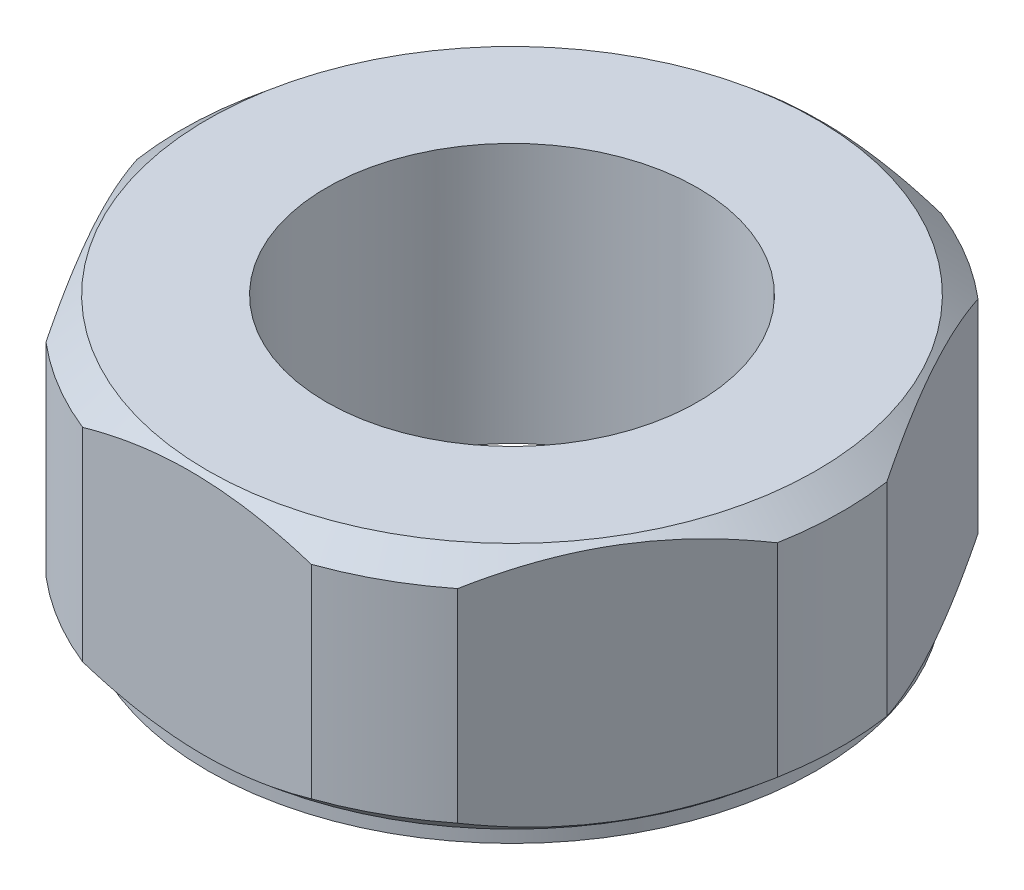
ISO-10303-21;
HEADER;
FILE_DESCRIPTION(('STEP AP214'),'2;1');
FILE_NAME('part.step','',(''),(''),'','','');
FILE_SCHEMA(('AUTOMOTIVE_DESIGN { 1 0 10303 214 1 1 1 1 }'));
ENDSEC;
DATA;
#1=APPLICATION_CONTEXT('core data for automotive mechanical design processes');
#2=APPLICATION_PROTOCOL_DEFINITION('international standard','automotive_design',2000,#1);
#3=PRODUCT_CONTEXT('',#1,'mechanical');
#4=PRODUCT('Part','Part','',(#3));
#5=PRODUCT_RELATED_PRODUCT_CATEGORY('part','',(#4));
#6=PRODUCT_DEFINITION_FORMATION('','',#4);
#7=PRODUCT_DEFINITION_CONTEXT('part definition',#1,'design');
#8=PRODUCT_DEFINITION('design','',#6,#7);
#9=PRODUCT_DEFINITION_SHAPE('','',#8);
#10=(LENGTH_UNIT() NAMED_UNIT(*) SI_UNIT(.MILLI.,.METRE.));
#11=(NAMED_UNIT(*) PLANE_ANGLE_UNIT() SI_UNIT($,.RADIAN.));
#12=(NAMED_UNIT(*) SI_UNIT($,.STERADIAN.) SOLID_ANGLE_UNIT());
#13=UNCERTAINTY_MEASURE_WITH_UNIT(LENGTH_MEASURE(1.E-05),#10,'distance_accuracy_value','');
#14=(GEOMETRIC_REPRESENTATION_CONTEXT(3) GLOBAL_UNCERTAINTY_ASSIGNED_CONTEXT((#13)) GLOBAL_UNIT_ASSIGNED_CONTEXT((#10,
#11,#12)) REPRESENTATION_CONTEXT('',''));
#15=CARTESIAN_POINT('',(0.,0.,0.));
#16=DIRECTION('',(0.,0.,1.));
#17=DIRECTION('',(1.,0.,0.));
#18=AXIS2_PLACEMENT_3D('',#15,#16,#17);
#19=CARTESIAN_POINT('',(0.,2.,0.));
#20=DIRECTION('',(0.,1.,0.));
#21=DIRECTION('',(0.,0.,1.));
#22=AXIS2_PLACEMENT_3D('',#19,#20,#21);
#23=PLANE('',#22);
#24=CARTESIAN_POINT('',(0.,2.,0.));
#25=DIRECTION('',(0.,1.,0.));
#26=DIRECTION('',(0.,0.,1.));
#27=AXIS2_PLACEMENT_3D('',#24,#25,#26);
#28=CIRCLE('',#27,1.5);
#29=CARTESIAN_POINT('',(0.,2.,1.5));
#30=VERTEX_POINT('',#29);
#31=EDGE_CURVE('E153',#30,#30,#28,.T.);
#32=ORIENTED_EDGE('',*,*,#31,.F.);
#33=EDGE_LOOP('',(#32));
#34=FACE_BOUND('',#33,.T.);
#35=CARTESIAN_POINT('',(0.,2.,0.));
#36=DIRECTION('',(0.,1.,0.));
#37=DIRECTION('',(0.,0.,1.));
#38=AXIS2_PLACEMENT_3D('',#35,#36,#37);
#39=CIRCLE('',#38,2.45945895598492);
#40=CARTESIAN_POINT('',(0.,2.,2.45945895598492));
#41=VERTEX_POINT('',#40);
#42=EDGE_CURVE('E139',#41,#41,#39,.F.);
#43=ORIENTED_EDGE('',*,*,#42,.F.);
#44=EDGE_LOOP('',(#43));
#45=FACE_BOUND('',#44,.T.);
#46=ADVANCED_FACE('F39',(#34,#45),#23,.T.);
#47=CARTESIAN_POINT('',(0.,2.2,0.));
#48=DIRECTION('',(0.,-1.,0.));
#49=DIRECTION('',(0.,0.,-1.));
#50=AXIS2_PLACEMENT_3D('',#47,#48,#49);
#51=CYLINDRICAL_SURFACE('',#50,1.5);
#52=ORIENTED_EDGE('',*,*,#31,.T.);
#53=EDGE_LOOP('',(#52));
#54=FACE_BOUND('',#53,.T.);
#55=CARTESIAN_POINT('',(0.,-0.1,0.));
#56=DIRECTION('',(0.,-1.,0.));
#57=DIRECTION('',(0.,0.,-1.));
#58=AXIS2_PLACEMENT_3D('',#55,#56,#57);
#59=CIRCLE('',#58,1.5);
#60=CARTESIAN_POINT('',(0.,-0.1,-1.5));
#61=VERTEX_POINT('',#60);
#62=EDGE_CURVE('E322',#61,#61,#59,.T.);
#63=ORIENTED_EDGE('',*,*,#62,.T.);
#64=EDGE_LOOP('',(#63));
#65=FACE_BOUND('',#64,.T.);
#66=ADVANCED_FACE('F211',(#54,#65),#51,.F.);
#67=CARTESIAN_POINT('',(0.,0.,0.));
#68=DIRECTION('',(0.,-1.,0.));
#69=DIRECTION('',(0.,0.,-1.));
#70=AXIS2_PLACEMENT_3D('',#67,#68,#69);
#71=CYLINDRICAL_SURFACE('',#70,2.67135379326874);
#72=CARTESIAN_POINT('',(0.,0.179295631547854,0.));
#73=DIRECTION('',(0.,-1.,0.));
#74=DIRECTION('',(0.,0.,-1.));
#75=AXIS2_PLACEMENT_3D('',#72,#73,#74);
#76=CIRCLE('',#75,2.67135379326874);
#77=CARTESIAN_POINT('',(-1.65580771527057,0.179295631547854,-2.09629003214292));
#78=VERTEX_POINT('',#77);
#79=CARTESIAN_POINT('',(-0.894830518071027,0.179295631547854,-2.51702392375203));
#80=VERTEX_POINT('',#79);
#81=EDGE_CURVE('E135',#78,#80,#76,.T.);
#82=ORIENTED_EDGE('',*,*,#81,.F.);
#83=DIRECTION('',(0.,-1.,0.));
#84=VECTOR('',#83,1.);
#85=CARTESIAN_POINT('',(-1.65580771527057,0.,-2.09629003214292));
#86=LINE('',#85,#84);
#87=CARTESIAN_POINT('',(-1.65580771527057,1.82070436845215,-2.09629003214292));
#88=VERTEX_POINT('',#87);
#89=EDGE_CURVE('E156',#88,#78,#86,.T.);
#90=ORIENTED_EDGE('',*,*,#89,.F.);
#91=CARTESIAN_POINT('',(0.,1.82070436845215,0.));
#92=DIRECTION('',(0.,-1.,0.));
#93=DIRECTION('',(0.,0.,-1.));
#94=AXIS2_PLACEMENT_3D('',#91,#92,#93);
#95=CIRCLE('',#94,2.67135379326874);
#96=CARTESIAN_POINT('',(-0.894830518071028,1.82070436845215,-2.51702392375203));
#97=VERTEX_POINT('',#96);
#98=EDGE_CURVE('E61',#88,#97,#95,.T.);
#99=ORIENTED_EDGE('',*,*,#98,.T.);
#100=DIRECTION('',(0.,-1.,0.));
#101=VECTOR('',#100,1.);
#102=CARTESIAN_POINT('',(-0.894830518071027,0.,-2.51702392375203));
#103=LINE('',#102,#101);
#104=EDGE_CURVE('E150',#80,#97,#103,.F.);
#105=ORIENTED_EDGE('',*,*,#104,.F.);
#106=EDGE_LOOP('',(#82,#90,#99,#105));
#107=FACE_BOUND('',#106,.T.);
#108=ADVANCED_FACE('F209',(#107),#71,.T.);
#109=CARTESIAN_POINT('',(0.987536563900582,1.82070436845215,-2.48211656127804));
#110=VERTEX_POINT('',#109);
#111=CARTESIAN_POINT('',(1.73239140086693,1.82070436845215,-2.03345792260711));
#112=VERTEX_POINT('',#111);
#113=EDGE_CURVE('E55',#110,#112,#95,.T.);
#114=ORIENTED_EDGE('',*,*,#113,.T.);
#115=DIRECTION('',(0.,-1.,0.));
#116=VECTOR('',#115,1.);
#117=CARTESIAN_POINT('',(1.73239140086693,0.,-2.03345792260711));
#118=LINE('',#117,#116);
#119=CARTESIAN_POINT('',(1.73239140086693,0.179295631547854,-2.03345792260711));
#120=VERTEX_POINT('',#119);
#121=EDGE_CURVE('E11',#120,#112,#118,.F.);
#122=ORIENTED_EDGE('',*,*,#121,.F.);
#123=CARTESIAN_POINT('',(0.987536563900581,0.179295631547854,-2.48211656127804));
#124=VERTEX_POINT('',#123);
#125=EDGE_CURVE('E132',#124,#120,#76,.T.);
#126=ORIENTED_EDGE('',*,*,#125,.F.);
#127=DIRECTION('',(0.,-1.,0.));
#128=VECTOR('',#127,1.);
#129=CARTESIAN_POINT('',(0.987536563900581,0.,-2.48211656127804));
#130=LINE('',#129,#128);
#131=EDGE_CURVE('E144',#110,#124,#130,.T.);
#132=ORIENTED_EDGE('',*,*,#131,.F.);
#133=EDGE_LOOP('',(#114,#122,#126,#132));
#134=FACE_BOUND('',#133,.T.);
#135=ADVANCED_FACE('F143',(#134),#71,.T.);
#136=CARTESIAN_POINT('',(-2.64334427917115,0.179295631547854,0.385826529135124));
#137=VERTEX_POINT('',#136);
#138=CARTESIAN_POINT('',(-2.62722191893795,0.179295631547854,-0.483566001144911));
#139=VERTEX_POINT('',#138);
#140=EDGE_CURVE('E333',#137,#139,#76,.T.);
#141=ORIENTED_EDGE('',*,*,#140,.F.);
#142=DIRECTION('',(0.,-1.,0.));
#143=VECTOR('',#142,1.);
#144=CARTESIAN_POINT('',(-2.64334427917115,0.,0.385826529135124));
#145=LINE('',#144,#143);
#146=CARTESIAN_POINT('',(-2.64334427917115,1.82070436845215,0.385826529135124));
#147=VERTEX_POINT('',#146);
#148=EDGE_CURVE('E353',#147,#137,#145,.T.);
#149=ORIENTED_EDGE('',*,*,#148,.F.);
#150=CARTESIAN_POINT('',(-2.62722191893795,1.82070436845215,-0.483566001144911));
#151=VERTEX_POINT('',#150);
#152=EDGE_CURVE('E329',#147,#151,#95,.T.);
#153=ORIENTED_EDGE('',*,*,#152,.T.);
#154=DIRECTION('',(0.,-1.,0.));
#155=VECTOR('',#154,1.);
#156=CARTESIAN_POINT('',(-2.62722191893795,0.,-0.483566001144911));
#157=LINE('',#156,#155);
#158=EDGE_CURVE('E151',#139,#151,#157,.F.);
#159=ORIENTED_EDGE('',*,*,#158,.F.);
#160=EDGE_LOOP('',(#141,#149,#153,#159));
#161=FACE_BOUND('',#160,.T.);
#162=ADVANCED_FACE('F373',(#161),#71,.T.);
#163=CARTESIAN_POINT('',(-0.987536563900581,0.179295631547854,2.48211656127804));
#164=VERTEX_POINT('',#163);
#165=CARTESIAN_POINT('',(-1.73239140086693,0.179295631547854,2.03345792260711));
#166=VERTEX_POINT('',#165);
#167=EDGE_CURVE('E183',#164,#166,#76,.T.);
#168=ORIENTED_EDGE('',*,*,#167,.F.);
#169=DIRECTION('',(0.,-1.,0.));
#170=VECTOR('',#169,1.);
#171=CARTESIAN_POINT('',(-0.987536563900581,0.,2.48211656127804));
#172=LINE('',#171,#170);
#173=CARTESIAN_POINT('',(-0.987536563900582,1.82070436845215,2.48211656127804));
#174=VERTEX_POINT('',#173);
#175=EDGE_CURVE('E348',#174,#164,#172,.T.);
#176=ORIENTED_EDGE('',*,*,#175,.F.);
#177=CARTESIAN_POINT('',(-1.73239140086693,1.82070436845215,2.03345792260711));
#178=VERTEX_POINT('',#177);
#179=EDGE_CURVE('E332',#174,#178,#95,.T.);
#180=ORIENTED_EDGE('',*,*,#179,.T.);
#181=DIRECTION('',(0.,-1.,0.));
#182=VECTOR('',#181,1.);
#183=CARTESIAN_POINT('',(-1.73239140086693,0.,2.03345792260711));
#184=LINE('',#183,#182);
#185=EDGE_CURVE('E345',#166,#178,#184,.F.);
#186=ORIENTED_EDGE('',*,*,#185,.F.);
#187=EDGE_LOOP('',(#168,#176,#180,#186));
#188=FACE_BOUND('',#187,.T.);
#189=ADVANCED_FACE('F344',(#188),#71,.T.);
#190=CARTESIAN_POINT('',(1.65580771527057,0.179295631547854,2.09629003214292));
#191=VERTEX_POINT('',#190);
#192=CARTESIAN_POINT('',(0.894830518071027,0.179295631547854,2.51702392375203));
#193=VERTEX_POINT('',#192);
#194=EDGE_CURVE('E181',#191,#193,#76,.T.);
#195=ORIENTED_EDGE('',*,*,#194,.F.);
#196=DIRECTION('',(0.,-1.,0.));
#197=VECTOR('',#196,1.);
#198=CARTESIAN_POINT('',(1.65580771527057,0.,2.09629003214292));
#199=LINE('',#198,#197);
#200=CARTESIAN_POINT('',(1.65580771527057,1.82070436845215,2.09629003214292));
#201=VERTEX_POINT('',#200);
#202=EDGE_CURVE('E361',#201,#191,#199,.T.);
#203=ORIENTED_EDGE('',*,*,#202,.F.);
#204=CARTESIAN_POINT('',(0.894830518071028,1.82070436845215,2.51702392375203));
#205=VERTEX_POINT('',#204);
#206=EDGE_CURVE('E334',#201,#205,#95,.T.);
#207=ORIENTED_EDGE('',*,*,#206,.T.);
#208=DIRECTION('',(0.,-1.,0.));
#209=VECTOR('',#208,1.);
#210=CARTESIAN_POINT('',(0.894830518071027,0.,2.51702392375203));
#211=LINE('',#210,#209);
#212=EDGE_CURVE('E356',#193,#205,#211,.F.);
#213=ORIENTED_EDGE('',*,*,#212,.F.);
#214=EDGE_LOOP('',(#195,#203,#207,#213));
#215=FACE_BOUND('',#214,.T.);
#216=ADVANCED_FACE('F364',(#215),#71,.T.);
#217=CARTESIAN_POINT('',(2.64334427917115,0.179295631547854,-0.385826529135124));
#218=VERTEX_POINT('',#217);
#219=CARTESIAN_POINT('',(2.62722191893795,0.179295631547854,0.483566001144912));
#220=VERTEX_POINT('',#219);
#221=EDGE_CURVE('E147',#218,#220,#76,.T.);
#222=ORIENTED_EDGE('',*,*,#221,.F.);
#223=DIRECTION('',(0.,-1.,0.));
#224=VECTOR('',#223,1.);
#225=CARTESIAN_POINT('',(2.64334427917115,0.,-0.385826529135124));
#226=LINE('',#225,#224);
#227=CARTESIAN_POINT('',(2.64334427917115,1.82070436845215,-0.385826529135123));
#228=VERTEX_POINT('',#227);
#229=EDGE_CURVE('E48',#228,#218,#226,.T.);
#230=ORIENTED_EDGE('',*,*,#229,.F.);
#231=CARTESIAN_POINT('',(2.62722191893795,1.82070436845215,0.483566001144911));
#232=VERTEX_POINT('',#231);
#233=EDGE_CURVE('E176',#228,#232,#95,.T.);
#234=ORIENTED_EDGE('',*,*,#233,.T.);
#235=DIRECTION('',(0.,-1.,0.));
#236=VECTOR('',#235,1.);
#237=CARTESIAN_POINT('',(2.62722191893795,0.,0.483566001144911));
#238=LINE('',#237,#236);
#239=EDGE_CURVE('E179',#220,#232,#238,.F.);
#240=ORIENTED_EDGE('',*,*,#239,.F.);
#241=EDGE_LOOP('',(#222,#230,#234,#240));
#242=FACE_BOUND('',#241,.T.);
#243=ADVANCED_FACE('F175',(#242),#71,.T.);
#244=CARTESIAN_POINT('',(0.,2.1201533044936,0.));
#245=DIRECTION('',(0.,-1.,0.));
#246=DIRECTION('',(0.,0.,-1.));
#247=AXIS2_PLACEMENT_3D('',#244,#245,#246);
#248=CONICAL_SURFACE('',#247,2.31745959612884,0.86853939528589);
#249=ORIENTED_EDGE('',*,*,#42,.T.);
#250=EDGE_LOOP('',(#249));
#251=FACE_BOUND('',#250,.T.);
#252=ORIENTED_EDGE('',*,*,#98,.F.);
#253=CARTESIAN_POINT('',(-2.62756790062973,1.82050436845009,-0.48299160869059));
#254=CARTESIAN_POINT('',(-2.57976745133208,1.84819513179343,-0.562349037255844));
#255=CARTESIAN_POINT('',(-2.53140214760345,1.87254775653625,-0.642644226779747));
#256=CARTESIAN_POINT('',(-2.43373078773835,1.91346572376297,-0.804796425707891));
#257=CARTESIAN_POINT('',(-2.38442338434999,1.93001888490003,-0.886655671795002));
#258=CARTESIAN_POINT('',(-2.28655036464267,1.95380711862474,-1.04914266269182));
#259=CARTESIAN_POINT('',(-2.23800080853135,1.9612823398053,-1.12974374463958));
#260=CARTESIAN_POINT('',(-2.14080703970175,1.96719511676207,-1.29110305569659));
#261=CARTESIAN_POINT('',(-2.09216296445635,1.96564143087895,-1.37186105657587));
#262=CARTESIAN_POINT('',(-1.97846609612281,1.95152158420265,-1.56061851052135));
#263=CARTESIAN_POINT('',(-1.9135250321642,1.93535099905129,-1.66843247293741));
#264=CARTESIAN_POINT('',(-1.81659414865339,1.90025363332564,-1.82935534661332));
#265=CARTESIAN_POINT('',(-1.78405946957423,1.88656533926616,-1.88336882365914));
#266=CARTESIAN_POINT('',(-1.71942958112745,1.85590328101938,-1.99066617820197));
#267=CARTESIAN_POINT('',(-1.68733405533733,1.83893203202015,-2.04395058101782));
#268=CARTESIAN_POINT('',(-1.65546173358235,1.82050436845216,-2.09686442459134));
#269=B_SPLINE_CURVE_WITH_KNOTS('',3,(#253,#254,#255,#256,#257,#258,#259,#260,#261,#262,#263,
#264,#265,#266,#267,#268),.UNSPECIFIED.,.F.,.F.,(4,2,2,2,2,2,2,4),(0.,0.290152804457502,
0.580757285006133,0.863493796471754,1.14595608991087,1.52558512714125,1.71908590640972,
1.91243902085421),.UNSPECIFIED.);
#270=EDGE_CURVE('E249',#151,#88,#269,.T.);
#271=ORIENTED_EDGE('',*,*,#270,.F.);
#272=ORIENTED_EDGE('',*,*,#152,.F.);
#273=CARTESIAN_POINT('',(-1.73206695325896,1.82050436845215,2.03404474776256));
#274=CARTESIAN_POINT('',(-1.77689227772656,1.84819513179525,1.95296963007605));
#275=CARTESIAN_POINT('',(-1.82224729979152,1.87254775653782,1.87093645362355));
#276=CARTESIAN_POINT('',(-1.91383954341003,1.91346572376408,1.70527447529454));
#277=CARTESIAN_POINT('',(-1.96007802836181,1.93001888490092,1.62164338832223));
#278=CARTESIAN_POINT('',(-2.05185938040904,1.95380711862523,1.45563937146261));
#279=CARTESIAN_POINT('',(-2.09738718689254,1.96128233980561,1.37329368155407));
#280=CARTESIAN_POINT('',(-2.18853156499003,1.96719511676206,1.20844175313002));
#281=CARTESIAN_POINT('',(-2.23414800768751,1.9656414308788,1.12593574778449));
#282=CARTESIAN_POINT('',(-2.34076832379075,1.95152158420227,0.933092644504968));
#283=CARTESIAN_POINT('',(-2.40166742214609,1.93535099905087,0.822945052160585));
#284=CARTESIAN_POINT('',(-2.49256527704353,1.90025363332529,0.658539007791875));
#285=CARTESIAN_POINT('',(-2.52307498077219,1.88656533926585,0.603356410682733));
#286=CARTESIAN_POINT('',(-2.58368227134143,1.8559032810192,0.493736608173249));
#287=CARTESIAN_POINT('',(-2.61378015491022,1.83893203202006,0.439298866083549));
#288=CARTESIAN_POINT('',(-2.64366872677912,1.82050436845216,0.385239703979671));
#289=B_SPLINE_CURVE_WITH_KNOTS('',3,(#273,#274,#275,#276,#277,#278,#279,#280,#281,#282,#283,
#284,#285,#286,#287,#288),.UNSPECIFIED.,.F.,.F.,(4,2,2,2,2,2,2,4),(0.,0.290152804456682,
0.580757285004482,0.863493796469343,1.14595608990771,1.52558512713613,1.71908590640356,
1.91243902084702),.UNSPECIFIED.);
#290=EDGE_CURVE('E257',#178,#147,#289,.T.);
#291=ORIENTED_EDGE('',*,*,#290,.F.);
#292=ORIENTED_EDGE('',*,*,#179,.F.);
#293=CARTESIAN_POINT('',(0.895500947367211,1.82050436845215,2.51703635645906));
#294=CARTESIAN_POINT('',(0.802875173602084,1.84819513179525,2.51531866733762));
#295=CARTESIAN_POINT('',(0.709154847808602,1.87254775653782,2.51358068040883));
#296=CARTESIAN_POINT('',(0.519891244325237,1.91346572376408,2.51007090100756));
#297=CARTESIAN_POINT('',(0.424345355985218,1.93001888490092,2.50829906012215));
#298=CARTESIAN_POINT('',(0.234690984230912,1.95380711862523,2.50478203415894));
#299=CARTESIAN_POINT('',(0.140613621636216,1.96128233980561,2.50303742619796));
#300=CARTESIAN_POINT('',(-0.0477245252906116,1.96719511676206,2.49954480883049));
#301=CARTESIAN_POINT('',(-0.141985043233363,1.9656414308788,2.49779680436402));
#302=CARTESIAN_POINT('',(-0.362302227669668,1.95152158420227,2.49371115502919));
#303=CARTESIAN_POINT('',(-0.488142389983266,1.93535099905087,2.49137752510029));
#304=CARTESIAN_POINT('',(-0.675971128391002,1.90025363332529,2.48789435440663));
#305=CARTESIAN_POINT('',(-0.739015511198653,1.88656533926585,2.48672523434302));
#306=CARTESIAN_POINT('',(-0.864252690214318,1.8559032810192,2.48440278637578));
#307=CARTESIAN_POINT('',(-0.926446099573056,1.83893203202006,2.48324944710165));
#308=CARTESIAN_POINT('',(-0.988206993196765,1.82050436845216,2.48210412857101));
#309=B_SPLINE_CURVE_WITH_KNOTS('',3,(#293,#294,#295,#296,#297,#298,#299,#300,#301,#302,#303,
#304,#305,#306,#307,#308),.UNSPECIFIED.,.F.,.F.,(4,2,2,2,2,2,2,4),(0.,0.290152804456682,
0.580757285004482,0.863493796469343,1.14595608990771,1.52558512713613,1.71908590640357,
1.91243902084702),.UNSPECIFIED.);
#310=EDGE_CURVE('E289',#205,#174,#309,.T.);
#311=ORIENTED_EDGE('',*,*,#310,.F.);
#312=ORIENTED_EDGE('',*,*,#206,.F.);
#313=CARTESIAN_POINT('',(2.62756790062973,1.82050436845009,0.482991608690589));
#314=CARTESIAN_POINT('',(2.57976745133208,1.84819513179343,0.562349037255844));
#315=CARTESIAN_POINT('',(2.53140214760345,1.87254775653625,0.642644226779747));
#316=CARTESIAN_POINT('',(2.43373078773835,1.91346572376297,0.804796425707891));
#317=CARTESIAN_POINT('',(2.38442338434999,1.93001888490003,0.886655671795002));
#318=CARTESIAN_POINT('',(2.28655036464267,1.95380711862474,1.04914266269182));
#319=CARTESIAN_POINT('',(2.23800080853135,1.9612823398053,1.12974374463958));
#320=CARTESIAN_POINT('',(2.14080703970175,1.96719511676207,1.29110305569659));
#321=CARTESIAN_POINT('',(2.09216296445635,1.96564143087895,1.37186105657587));
#322=CARTESIAN_POINT('',(1.97846609612281,1.95152158420265,1.56061851052135));
#323=CARTESIAN_POINT('',(1.9135250321642,1.93535099905129,1.66843247293741));
#324=CARTESIAN_POINT('',(1.81659414865339,1.90025363332564,1.82935534661332));
#325=CARTESIAN_POINT('',(1.78405946957423,1.88656533926616,1.88336882365914));
#326=CARTESIAN_POINT('',(1.71942958112745,1.85590328101938,1.99066617820197));
#327=CARTESIAN_POINT('',(1.68733405533733,1.83893203202015,2.04395058101782));
#328=CARTESIAN_POINT('',(1.65546173358235,1.82050436845216,2.09686442459134));
#329=B_SPLINE_CURVE_WITH_KNOTS('',3,(#313,#314,#315,#316,#317,#318,#319,#320,#321,#322,#323,
#324,#325,#326,#327,#328),.UNSPECIFIED.,.F.,.F.,(4,2,2,2,2,2,2,4),(0.,0.290152804457502,
0.580757285006133,0.863493796471755,1.14595608991087,1.52558512714126,1.71908590640972,
1.91243902085421),.UNSPECIFIED.);
#330=EDGE_CURVE('E283',#232,#201,#329,.T.);
#331=ORIENTED_EDGE('',*,*,#330,.F.);
#332=ORIENTED_EDGE('',*,*,#233,.F.);
#333=CARTESIAN_POINT('',(1.73206695325895,1.82050436845214,-2.03404474776259));
#334=CARTESIAN_POINT('',(1.77689227772654,1.84819513179524,-1.95296963007608));
#335=CARTESIAN_POINT('',(1.82224729979151,1.87254775653782,-1.87093645362357));
#336=CARTESIAN_POINT('',(1.91383954341001,1.91346572376408,-1.70527447529456));
#337=CARTESIAN_POINT('',(1.9600780283618,1.93001888490092,-1.62164338832225));
#338=CARTESIAN_POINT('',(2.05185938040903,1.95380711862523,-1.45563937146263));
#339=CARTESIAN_POINT('',(2.09738718689253,1.96128233980561,-1.37329368155409));
#340=CARTESIAN_POINT('',(2.18853156499002,1.96719511676206,-1.20844175313004));
#341=CARTESIAN_POINT('',(2.2341480076875,1.9656414308788,-1.1259357477845));
#342=CARTESIAN_POINT('',(2.34076832379074,1.95152158420227,-0.93309264450498));
#343=CARTESIAN_POINT('',(2.40166742214608,1.93535099905087,-0.822945052160594));
#344=CARTESIAN_POINT('',(2.49256527704353,1.90025363332529,-0.658539007791881));
#345=CARTESIAN_POINT('',(2.52307498077219,1.88656533926585,-0.603356410682737));
#346=CARTESIAN_POINT('',(2.58368227134143,1.8559032810192,-0.493736608173251));
#347=CARTESIAN_POINT('',(2.61378015491022,1.83893203202006,-0.43929886608355));
#348=CARTESIAN_POINT('',(2.64366872677912,1.82050436845216,-0.38523970397967));
#349=B_SPLINE_CURVE_WITH_KNOTS('',3,(#333,#334,#335,#336,#337,#338,#339,#340,#341,#342,#343,
#344,#345,#346,#347,#348),.UNSPECIFIED.,.F.,.F.,(4,2,2,2,2,2,2,4),(0.,0.290152804456686,
0.580757285004488,0.863493796469352,1.14595608990772,1.52558512713615,1.71908590640359,
1.91243902084705),.UNSPECIFIED.);
#350=EDGE_CURVE('E166',#112,#228,#349,.T.);
#351=ORIENTED_EDGE('',*,*,#350,.F.);
#352=ORIENTED_EDGE('',*,*,#113,.F.);
#353=CARTESIAN_POINT('',(-0.895500947367212,1.82050436845215,-2.51703635645906));
#354=CARTESIAN_POINT('',(-0.802875173602085,1.84819513179525,-2.51531866733762));
#355=CARTESIAN_POINT('',(-0.709154847808603,1.87254775653782,-2.51358068040883));
#356=CARTESIAN_POINT('',(-0.519891244325237,1.91346572376408,-2.51007090100756));
#357=CARTESIAN_POINT('',(-0.424345355985219,1.93001888490092,-2.50829906012215));
#358=CARTESIAN_POINT('',(-0.234690984230912,1.95380711862523,-2.50478203415894));
#359=CARTESIAN_POINT('',(-0.140613621636216,1.96128233980561,-2.50303742619796));
#360=CARTESIAN_POINT('',(0.0477245252906113,1.96719511676206,-2.49954480883049));
#361=CARTESIAN_POINT('',(0.141985043233362,1.9656414308788,-2.49779680436402));
#362=CARTESIAN_POINT('',(0.362302227669668,1.95152158420227,-2.49371115502919));
#363=CARTESIAN_POINT('',(0.488142389983266,1.93535099905087,-2.49137752510029));
#364=CARTESIAN_POINT('',(0.675971128391002,1.90025363332529,-2.48789435440663));
#365=CARTESIAN_POINT('',(0.739015511198653,1.88656533926585,-2.48672523434302));
#366=CARTESIAN_POINT('',(0.864252690214318,1.8559032810192,-2.48440278637578));
#367=CARTESIAN_POINT('',(0.926446099573056,1.83893203202006,-2.48324944710165));
#368=CARTESIAN_POINT('',(0.988206993196766,1.82050436845216,-2.48210412857101));
#369=B_SPLINE_CURVE_WITH_KNOTS('',3,(#353,#354,#355,#356,#357,#358,#359,#360,#361,#362,#363,
#364,#365,#366,#367,#368),.UNSPECIFIED.,.F.,.F.,(4,2,2,2,2,2,2,4),(0.,0.290152804456683,
0.580757285004482,0.863493796469344,1.14595608990771,1.52558512713613,1.71908590640357,
1.91243902084703),.UNSPECIFIED.);
#370=EDGE_CURVE('E149',#97,#110,#369,.T.);
#371=ORIENTED_EDGE('',*,*,#370,.F.);
#372=EDGE_LOOP('',(#252,#271,#272,#291,#292,#311,#312,#331,#332,#351,#352,#371));
#373=FACE_BOUND('',#372,.T.);
#374=ADVANCED_FACE('F207',(#251,#373),#248,.T.);
#375=CARTESIAN_POINT('',(0.,0.179295631547854,0.));
#376=DIRECTION('',(0.,1.,0.));
#377=DIRECTION('',(0.,0.,1.));
#378=AXIS2_PLACEMENT_3D('',#375,#376,#377);
#379=CONICAL_SURFACE('',#378,2.67135379326874,0.86853939528589);
#380=CARTESIAN_POINT('',(0.,0.,0.));
#381=DIRECTION('',(0.,1.,0.));
#382=DIRECTION('',(0.,0.,1.));
#383=AXIS2_PLACEMENT_3D('',#380,#381,#382);
#384=CIRCLE('',#383,2.45945895598492);
#385=CARTESIAN_POINT('',(0.,0.,2.45945895598492));
#386=VERTEX_POINT('',#385);
#387=EDGE_CURVE('E146',#386,#386,#384,.F.);
#388=ORIENTED_EDGE('',*,*,#387,.F.);
#389=EDGE_LOOP('',(#388));
#390=FACE_BOUND('',#389,.T.);
#391=ORIENTED_EDGE('',*,*,#125,.T.);
#392=CARTESIAN_POINT('',(2.64366872677912,0.179495631547854,-0.38523970397967));
#393=CARTESIAN_POINT('',(2.59884340231152,0.151804868204751,-0.466314821666178));
#394=CARTESIAN_POINT('',(2.55348838024656,0.127452243462176,-0.548347998118683));
#395=CARTESIAN_POINT('',(2.46189613662805,0.0865342762359171,-0.714009976447696));
#396=CARTESIAN_POINT('',(2.41565765167627,0.0699811150990768,-0.797641063420007));
#397=CARTESIAN_POINT('',(2.32387629962903,0.046192881374771,-0.963645080279624));
#398=CARTESIAN_POINT('',(2.27834849314553,0.0387176601943913,-1.04599077018816));
#399=CARTESIAN_POINT('',(2.18720411504805,0.0328048832379439,-1.21084269861221));
#400=CARTESIAN_POINT('',(2.14158767235056,0.0343585691211967,-1.29334870395775));
#401=CARTESIAN_POINT('',(2.03496735624733,0.0484784157977327,-1.48619180723727));
#402=CARTESIAN_POINT('',(1.97406825789198,0.0646490009491337,-1.59633939958166));
#403=CARTESIAN_POINT('',(1.88317040299454,0.0997463666747157,-1.76074544395038));
#404=CARTESIAN_POINT('',(1.85266069926587,0.113434660734154,-1.81592804105952));
#405=CARTESIAN_POINT('',(1.79205340869663,0.144096718980808,-1.92554784356901));
#406=CARTESIAN_POINT('',(1.76195552512785,0.16106796797995,-1.97998558565871));
#407=CARTESIAN_POINT('',(1.73206695325895,0.17949563154785,-2.03404474776259));
#408=B_SPLINE_CURVE_WITH_KNOTS('',3,(#392,#393,#394,#395,#396,#397,#398,#399,#400,#401,#402,
#403,#404,#405,#406,#407),.UNSPECIFIED.,.F.,.F.,(4,2,2,2,2,2,2,4),(0.,0.290152804456683,
0.580757285004483,0.863493796469344,1.14595608990771,1.52558512713614,1.71908590640359,
1.91243902084706),.UNSPECIFIED.);
#409=EDGE_CURVE('E164',#218,#120,#408,.T.);
#410=ORIENTED_EDGE('',*,*,#409,.F.);
#411=ORIENTED_EDGE('',*,*,#221,.T.);
#412=CARTESIAN_POINT('',(1.65546173358235,0.179495631547854,2.09686442459134));
#413=CARTESIAN_POINT('',(1.70326218287988,0.15180486820475,2.01750699602627));
#414=CARTESIAN_POINT('',(1.7516274866084,0.127452243462175,1.93721180650255));
#415=CARTESIAN_POINT('',(1.84929884647326,0.0865342762359142,1.7750596075748));
#416=CARTESIAN_POINT('',(1.8986062498615,0.0699811150990737,1.69320036148789));
#417=CARTESIAN_POINT('',(1.99647926956857,0.0461928813747694,1.53071337059149));
#418=CARTESIAN_POINT('',(2.04502882567977,0.0387176601943906,1.45011228864394));
#419=CARTESIAN_POINT('',(2.14222259450911,0.0328048832379437,1.28875297758736));
#420=CARTESIAN_POINT('',(2.19086666975437,0.034358569121196,1.2079949767083));
#421=CARTESIAN_POINT('',(2.30456353808805,0.0484784157978072,1.01923752276261));
#422=CARTESIAN_POINT('',(2.3695046020469,0.0646490009494336,0.911423560346132));
#423=CARTESIAN_POINT('',(2.46643548555808,0.0997463666755381,0.750500686669607));
#424=CARTESIAN_POINT('',(2.49897016463737,0.113434660735186,0.696487209623578));
#425=CARTESIAN_POINT('',(2.56360005308439,0.144096718982312,0.589189855080351));
#426=CARTESIAN_POINT('',(2.59569557887463,0.161067967981716,0.535905452264306));
#427=CARTESIAN_POINT('',(2.62756790062973,0.179495631549898,0.482991608690588));
#428=B_SPLINE_CURVE_WITH_KNOTS('',3,(#412,#413,#414,#415,#416,#417,#418,#419,#420,#421,#422,
#423,#424,#425,#426,#427),.UNSPECIFIED.,.F.,.F.,(4,2,2,2,2,2,2,4),(0.,0.290152804456693,
0.580757285004504,0.863493796469354,1.14595608990771,1.52558512713964,1.71908590640892,
1.91243902085421),.UNSPECIFIED.);
#429=EDGE_CURVE('E194',#191,#220,#428,.T.);
#430=ORIENTED_EDGE('',*,*,#429,.F.);
#431=ORIENTED_EDGE('',*,*,#194,.T.);
#432=CARTESIAN_POINT('',(-0.988206993196766,0.179495631547854,2.48210412857101));
#433=CARTESIAN_POINT('',(-0.895581219431639,0.151804868204751,2.48382181769245));
#434=CARTESIAN_POINT('',(-0.801860893638157,0.127452243462176,2.48555980462124));
#435=CARTESIAN_POINT('',(-0.612597290154791,0.0865342762359172,2.4890695840225));
#436=CARTESIAN_POINT('',(-0.517051401814773,0.0699811150990768,2.49084142490791));
#437=CARTESIAN_POINT('',(-0.327397030060467,0.0461928813747712,2.49435845087113));
#438=CARTESIAN_POINT('',(-0.23331966746577,0.0387176601943916,2.49610305883211));
#439=CARTESIAN_POINT('',(-0.0449815205389431,0.0328048832379441,2.49959567619958));
#440=CARTESIAN_POINT('',(0.049278997403808,0.0343585691211967,2.50134368066605));
#441=CARTESIAN_POINT('',(0.269596181840114,0.0484784157977323,2.50542933000088));
#442=CARTESIAN_POINT('',(0.395436344153713,0.0646490009491328,2.50776295992978));
#443=CARTESIAN_POINT('',(0.583265082561449,0.0997463666747127,2.51124613062344));
#444=CARTESIAN_POINT('',(0.6463094653691,0.11343466073415,2.51241525068705));
#445=CARTESIAN_POINT('',(0.771546644384765,0.144096718980802,2.51473769865428));
#446=CARTESIAN_POINT('',(0.833740053743503,0.161067967979943,2.51589103792842));
#447=CARTESIAN_POINT('',(0.895500947367213,0.179495631547842,2.51703635645906));
#448=B_SPLINE_CURVE_WITH_KNOTS('',3,(#432,#433,#434,#435,#436,#437,#438,#439,#440,#441,#442,
#443,#444,#445,#446,#447),.UNSPECIFIED.,.F.,.F.,(4,2,2,2,2,2,2,4),(0.,0.290152804456683,
0.580757285004482,0.863493796469343,1.14595608990771,1.52558512713613,1.71908590640357,
1.91243902084703),.UNSPECIFIED.);
#449=EDGE_CURVE('E217',#164,#193,#448,.T.);
#450=ORIENTED_EDGE('',*,*,#449,.F.);
#451=ORIENTED_EDGE('',*,*,#167,.T.);
#452=CARTESIAN_POINT('',(-2.64366872677912,0.179495631547854,0.385239703979671));
#453=CARTESIAN_POINT('',(-2.59884340231152,0.151804868204751,0.46631482166618));
#454=CARTESIAN_POINT('',(-2.55348838024656,0.127452243462177,0.548347998118684));
#455=CARTESIAN_POINT('',(-2.46189613662805,0.0865342762359173,0.714009976447697));
#456=CARTESIAN_POINT('',(-2.41565765167627,0.069981115099077,0.797641063420009));
#457=CARTESIAN_POINT('',(-2.32387629962903,0.0461928813747715,0.963645080279626));
#458=CARTESIAN_POINT('',(-2.27834849314553,0.0387176601943922,1.04599077018816));
#459=CARTESIAN_POINT('',(-2.18720411504805,0.0328048832379448,1.21084269861222));
#460=CARTESIAN_POINT('',(-2.14158767235056,0.0343585691211972,1.29334870395775));
#461=CARTESIAN_POINT('',(-2.03496735624733,0.0484784157977327,1.48619180723727));
#462=CARTESIAN_POINT('',(-1.97406825789199,0.0646490009491332,1.59633939958165));
#463=CARTESIAN_POINT('',(-1.88317040299455,0.099746366674713,1.76074544395036));
#464=CARTESIAN_POINT('',(-1.85266069926588,0.11343466073415,1.8159280410595));
#465=CARTESIAN_POINT('',(-1.79205340869665,0.144096718980802,1.92554784356899));
#466=CARTESIAN_POINT('',(-1.76195552512786,0.161067967979943,1.97998558565869));
#467=CARTESIAN_POINT('',(-1.73206695325896,0.179495631547842,2.03404474776256));
#468=B_SPLINE_CURVE_WITH_KNOTS('',3,(#452,#453,#454,#455,#456,#457,#458,#459,#460,#461,#462,
#463,#464,#465,#466,#467),.UNSPECIFIED.,.F.,.F.,(4,2,2,2,2,2,2,4),(0.,0.290152804456682,
0.580757285004482,0.863493796469343,1.14595608990771,1.52558512713613,1.71908590640357,
1.91243902084702),.UNSPECIFIED.);
#469=EDGE_CURVE('E224',#137,#166,#468,.T.);
#470=ORIENTED_EDGE('',*,*,#469,.F.);
#471=ORIENTED_EDGE('',*,*,#140,.T.);
#472=CARTESIAN_POINT('',(-1.65546173358235,0.179495631547855,-2.09686442459134));
#473=CARTESIAN_POINT('',(-1.70326218287988,0.15180486820475,-2.01750699602627));
#474=CARTESIAN_POINT('',(-1.7516274866084,0.127452243462175,-1.93721180650255));
#475=CARTESIAN_POINT('',(-1.84929884647327,0.0865342762359145,-1.7750596075748));
#476=CARTESIAN_POINT('',(-1.8986062498615,0.069981115099074,-1.69320036148789));
#477=CARTESIAN_POINT('',(-1.99647926956857,0.0461928813747696,-1.53071337059149));
#478=CARTESIAN_POINT('',(-2.04502882567977,0.0387176601943908,-1.45011228864394));
#479=CARTESIAN_POINT('',(-2.14222259450911,0.0328048832379438,-1.28875297758736));
#480=CARTESIAN_POINT('',(-2.19086666975437,0.0343585691211962,-1.2079949767083));
#481=CARTESIAN_POINT('',(-2.30456353808805,0.0484784157978074,-1.01923752276261));
#482=CARTESIAN_POINT('',(-2.3695046020469,0.0646490009494339,-0.911423560346131));
#483=CARTESIAN_POINT('',(-2.46643548555808,0.0997463666755384,-0.750500686669606));
#484=CARTESIAN_POINT('',(-2.49897016463737,0.113434660735186,-0.696487209623577));
#485=CARTESIAN_POINT('',(-2.56360005308439,0.144096718982312,-0.58918985508035));
#486=CARTESIAN_POINT('',(-2.59569557887463,0.161067967981716,-0.535905452264305));
#487=CARTESIAN_POINT('',(-2.62756790062973,0.179495631549898,-0.482991608690588));
#488=B_SPLINE_CURVE_WITH_KNOTS('',3,(#472,#473,#474,#475,#476,#477,#478,#479,#480,#481,#482,
#483,#484,#485,#486,#487),.UNSPECIFIED.,.F.,.F.,(4,2,2,2,2,2,2,4),(0.,0.290152804456694,
0.580757285004505,0.863493796469355,1.14595608990771,1.52558512713964,1.71908590640892,
1.91243902085421),.UNSPECIFIED.);
#489=EDGE_CURVE('E140',#78,#139,#488,.T.);
#490=ORIENTED_EDGE('',*,*,#489,.F.);
#491=ORIENTED_EDGE('',*,*,#81,.T.);
#492=CARTESIAN_POINT('',(0.988206993196765,0.179495631547854,-2.48210412857101));
#493=CARTESIAN_POINT('',(0.895581219431638,0.151804868204751,-2.48382181769245));
#494=CARTESIAN_POINT('',(0.801860893638157,0.127452243462176,-2.48555980462124));
#495=CARTESIAN_POINT('',(0.612597290154791,0.0865342762359172,-2.4890695840225));
#496=CARTESIAN_POINT('',(0.517051401814773,0.0699811150990768,-2.49084142490791));
#497=CARTESIAN_POINT('',(0.327397030060466,0.0461928813747712,-2.49435845087113));
#498=CARTESIAN_POINT('',(0.23331966746577,0.0387176601943916,-2.49610305883211));
#499=CARTESIAN_POINT('',(0.044981520538943,0.0328048832379441,-2.49959567619958));
#500=CARTESIAN_POINT('',(-0.049278997403808,0.0343585691211966,-2.50134368066605));
#501=CARTESIAN_POINT('',(-0.269596181840114,0.0484784157977323,-2.50542933000088));
#502=CARTESIAN_POINT('',(-0.395436344153713,0.0646490009491327,-2.50776295992978));
#503=CARTESIAN_POINT('',(-0.583265082561449,0.0997463666747127,-2.51124613062344));
#504=CARTESIAN_POINT('',(-0.6463094653691,0.11343466073415,-2.51241525068705));
#505=CARTESIAN_POINT('',(-0.771546644384765,0.144096718980802,-2.51473769865428));
#506=CARTESIAN_POINT('',(-0.833740053743503,0.161067967979943,-2.51589103792842));
#507=CARTESIAN_POINT('',(-0.895500947367213,0.179495631547842,-2.51703635645906));
#508=B_SPLINE_CURVE_WITH_KNOTS('',3,(#492,#493,#494,#495,#496,#497,#498,#499,#500,#501,#502,
#503,#504,#505,#506,#507),.UNSPECIFIED.,.F.,.F.,(4,2,2,2,2,2,2,4),(0.,0.290152804456682,
0.580757285004482,0.863493796469343,1.14595608990771,1.52558512713613,1.71908590640357,
1.91243902084703),.UNSPECIFIED.);
#509=EDGE_CURVE('E129',#124,#80,#508,.T.);
#510=ORIENTED_EDGE('',*,*,#509,.F.);
#511=EDGE_LOOP('',(#391,#410,#411,#430,#431,#450,#451,#470,#471,#490,#491,#510));
#512=FACE_BOUND('',#511,.T.);
#513=ADVANCED_FACE('F131',(#390,#512),#379,.T.);
#514=CARTESIAN_POINT('',(2.88625510474887,2.,0.0535238605151988));
#515=DIRECTION('',(-0.875147136007615,0.,0.483856890348447));
#516=DIRECTION('',(0.483856890348447,0.,0.875147136007615));
#517=AXIS2_PLACEMENT_3D('',#514,#515,#516);
#518=PLANE('',#517);
#519=ORIENTED_EDGE('',*,*,#229,.T.);
#520=ORIENTED_EDGE('',*,*,#409,.T.);
#521=ORIENTED_EDGE('',*,*,#121,.T.);
#522=ORIENTED_EDGE('',*,*,#350,.T.);
#523=EDGE_LOOP('',(#519,#520,#521,#522));
#524=FACE_BOUND('',#523,.T.);
#525=ADVANCED_FACE('F171',(#524),#518,.F.);
#526=CARTESIAN_POINT('',(1.39677452945965,2.,2.52633217277263));
#527=DIRECTION('',(-0.856605926841704,0.,-0.515971206657567));
#528=DIRECTION('',(-0.515971206657567,0.,0.856605926841704));
#529=AXIS2_PLACEMENT_3D('',#526,#527,#528);
#530=PLANE('',#529);
#531=ORIENTED_EDGE('',*,*,#202,.T.);
#532=ORIENTED_EDGE('',*,*,#429,.T.);
#533=ORIENTED_EDGE('',*,*,#239,.T.);
#534=ORIENTED_EDGE('',*,*,#330,.T.);
#535=EDGE_LOOP('',(#531,#532,#533,#534));
#536=FACE_BOUND('',#535,.T.);
#537=ADVANCED_FACE('F298',(#536),#530,.F.);
#538=CARTESIAN_POINT('',(-1.48948057528921,2.,2.47280831225743));
#539=DIRECTION('',(0.0185412091659108,0.,-0.999828097006013));
#540=DIRECTION('',(-0.999828097006013,0.,-0.0185412091659108));
#541=AXIS2_PLACEMENT_3D('',#538,#539,#540);
#542=PLANE('',#541);
#543=ORIENTED_EDGE('',*,*,#175,.T.);
#544=ORIENTED_EDGE('',*,*,#449,.T.);
#545=ORIENTED_EDGE('',*,*,#212,.T.);
#546=ORIENTED_EDGE('',*,*,#310,.T.);
#547=EDGE_LOOP('',(#543,#544,#545,#546));
#548=FACE_BOUND('',#547,.T.);
#549=ADVANCED_FACE('F295',(#548),#542,.F.);
#550=CARTESIAN_POINT('',(-2.88625510474887,2.,-0.0535238605151982));
#551=DIRECTION('',(0.875147136007615,0.,-0.483856890348447));
#552=DIRECTION('',(-0.483856890348447,0.,-0.875147136007615));
#553=AXIS2_PLACEMENT_3D('',#550,#551,#552);
#554=PLANE('',#553);
#555=ORIENTED_EDGE('',*,*,#148,.T.);
#556=ORIENTED_EDGE('',*,*,#469,.T.);
#557=ORIENTED_EDGE('',*,*,#185,.T.);
#558=ORIENTED_EDGE('',*,*,#290,.T.);
#559=EDGE_LOOP('',(#555,#556,#557,#558));
#560=FACE_BOUND('',#559,.T.);
#561=ADVANCED_FACE('F244',(#560),#554,.F.);
#562=CARTESIAN_POINT('',(-1.39677452945966,2.,-2.52633217277263));
#563=DIRECTION('',(0.856605926841704,0.,0.515971206657566));
#564=DIRECTION('',(0.515971206657566,0.,-0.856605926841704));
#565=AXIS2_PLACEMENT_3D('',#562,#563,#564);
#566=PLANE('',#565);
#567=ORIENTED_EDGE('',*,*,#89,.T.);
#568=ORIENTED_EDGE('',*,*,#489,.T.);
#569=ORIENTED_EDGE('',*,*,#158,.T.);
#570=ORIENTED_EDGE('',*,*,#270,.T.);
#571=EDGE_LOOP('',(#567,#568,#569,#570));
#572=FACE_BOUND('',#571,.T.);
#573=ADVANCED_FACE('F241',(#572),#566,.F.);
#574=CARTESIAN_POINT('',(1.48948057528921,2.,-2.47280831225743));
#575=DIRECTION('',(-0.0185412091659108,0.,0.999828097006013));
#576=DIRECTION('',(0.999828097006013,0.,0.0185412091659108));
#577=AXIS2_PLACEMENT_3D('',#574,#575,#576);
#578=PLANE('',#577);
#579=ORIENTED_EDGE('',*,*,#131,.T.);
#580=ORIENTED_EDGE('',*,*,#509,.T.);
#581=ORIENTED_EDGE('',*,*,#104,.T.);
#582=ORIENTED_EDGE('',*,*,#370,.T.);
#583=EDGE_LOOP('',(#579,#580,#581,#582));
#584=FACE_BOUND('',#583,.T.);
#585=ADVANCED_FACE('F41',(#584),#578,.F.);
#586=CARTESIAN_POINT('',(0.,-0.1,0.));
#587=DIRECTION('',(0.,-1.,0.));
#588=DIRECTION('',(0.,0.,-1.));
#589=AXIS2_PLACEMENT_3D('',#586,#587,#588);
#590=PLANE('',#589);
#591=CARTESIAN_POINT('',(0.,-0.1,0.));
#592=DIRECTION('',(0.,-1.,0.));
#593=DIRECTION('',(0.,0.,-1.));
#594=AXIS2_PLACEMENT_3D('',#591,#592,#593);
#595=CIRCLE('',#594,2.45945895598492);
#596=CARTESIAN_POINT('',(0.,-0.1,-2.45945895598492));
#597=VERTEX_POINT('',#596);
#598=EDGE_CURVE('E324',#597,#597,#595,.T.);
#599=ORIENTED_EDGE('',*,*,#598,.T.);
#600=EDGE_LOOP('',(#599));
#601=FACE_BOUND('',#600,.T.);
#602=ORIENTED_EDGE('',*,*,#62,.F.);
#603=EDGE_LOOP('',(#602));
#604=FACE_BOUND('',#603,.T.);
#605=ADVANCED_FACE('F427',(#601,#604),#590,.T.);
#606=CARTESIAN_POINT('',(0.,-0.1,0.));
#607=DIRECTION('',(0.,1.,0.));
#608=DIRECTION('',(0.,0.,1.));
#609=AXIS2_PLACEMENT_3D('',#606,#607,#608);
#610=CYLINDRICAL_SURFACE('',#609,2.45945895598492);
#611=ORIENTED_EDGE('',*,*,#598,.F.);
#612=EDGE_LOOP('',(#611));
#613=FACE_BOUND('',#612,.T.);
#614=ORIENTED_EDGE('',*,*,#387,.T.);
#615=EDGE_LOOP('',(#614));
#616=FACE_BOUND('',#615,.T.);
#617=ADVANCED_FACE('F272',(#613,#616),#610,.T.);
#618=CLOSED_SHELL('',(#46,#66,#108,#135,#162,#189,#216,#243,#374,#513,#525,#537,#549,#561,#573,
#585,#605,#617));
#619=MANIFOLD_SOLID_BREP('B2',#618);
#620=ADVANCED_BREP_SHAPE_REPRESENTATION('',(#18,#619),#14);
#621=SHAPE_DEFINITION_REPRESENTATION(#9,#620);
ENDSEC;
END-ISO-10303-21;
